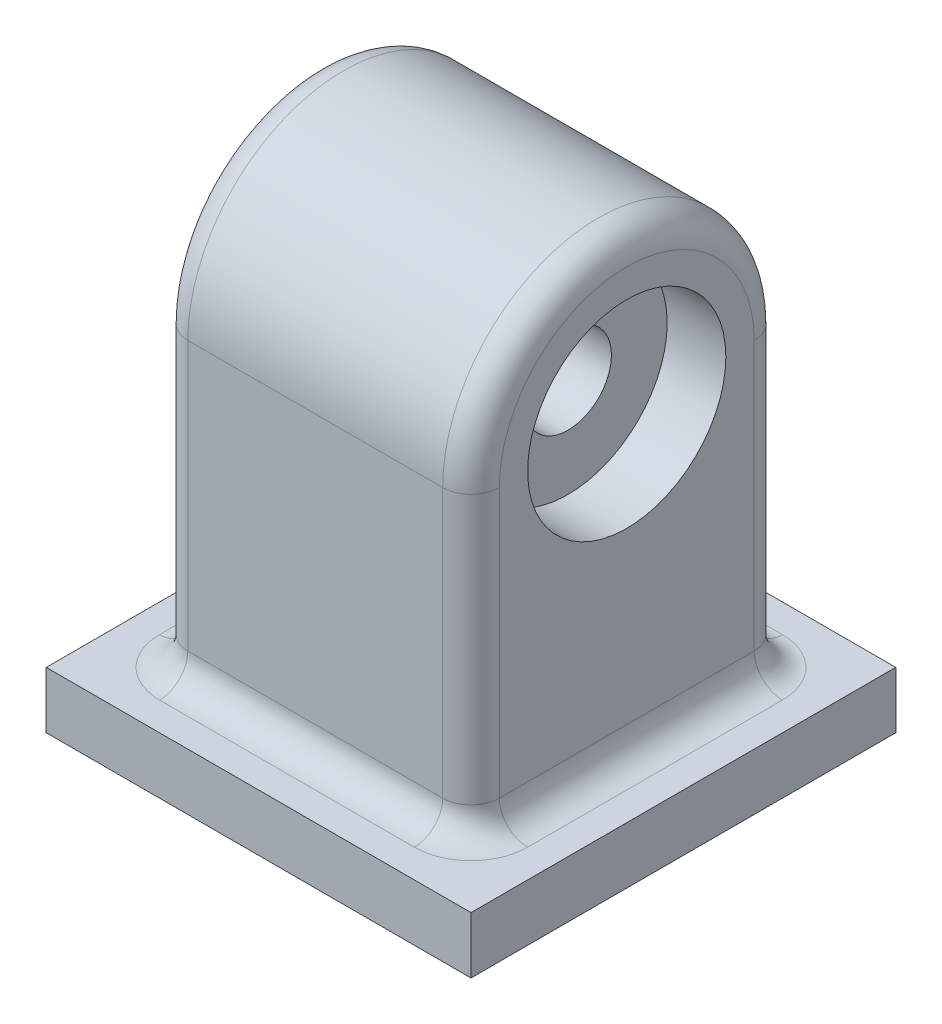
ISO-10303-21;
HEADER;
FILE_DESCRIPTION(('STEP AP214'),'2;1');
FILE_NAME('part.step','',(''),(''),'','','');
FILE_SCHEMA(('AUTOMOTIVE_DESIGN { 1 0 10303 214 1 1 1 1 }'));
ENDSEC;
DATA;
#1=APPLICATION_CONTEXT('core data for automotive mechanical design processes');
#2=APPLICATION_PROTOCOL_DEFINITION('international standard','automotive_design',2000,#1);
#3=PRODUCT_CONTEXT('',#1,'mechanical');
#4=PRODUCT('Part','Part','',(#3));
#5=PRODUCT_RELATED_PRODUCT_CATEGORY('part','',(#4));
#6=PRODUCT_DEFINITION_FORMATION('','',#4);
#7=PRODUCT_DEFINITION_CONTEXT('part definition',#1,'design');
#8=PRODUCT_DEFINITION('design','',#6,#7);
#9=PRODUCT_DEFINITION_SHAPE('','',#8);
#10=(LENGTH_UNIT() NAMED_UNIT(*) SI_UNIT(.MILLI.,.METRE.));
#11=(NAMED_UNIT(*) PLANE_ANGLE_UNIT() SI_UNIT($,.RADIAN.));
#12=(NAMED_UNIT(*) SI_UNIT($,.STERADIAN.) SOLID_ANGLE_UNIT());
#13=UNCERTAINTY_MEASURE_WITH_UNIT(LENGTH_MEASURE(1.E-05),#10,'distance_accuracy_value','');
#14=(GEOMETRIC_REPRESENTATION_CONTEXT(3) GLOBAL_UNCERTAINTY_ASSIGNED_CONTEXT((#13)) GLOBAL_UNIT_ASSIGNED_CONTEXT((#10,
#11,#12)) REPRESENTATION_CONTEXT('',''));
#15=CARTESIAN_POINT('',(0.,0.,0.));
#16=DIRECTION('',(0.,0.,1.));
#17=DIRECTION('',(1.,0.,0.));
#18=AXIS2_PLACEMENT_3D('',#15,#16,#17);
#19=CARTESIAN_POINT('',(0.,25.4,0.));
#20=DIRECTION('',(0.,1.,0.));
#21=DIRECTION('',(0.,0.,1.));
#22=AXIS2_PLACEMENT_3D('',#19,#20,#21);
#23=PLANE('',#22);
#24=DIRECTION('',(0.,0.,-1.));
#25=VECTOR('',#24,1.);
#26=CARTESIAN_POINT('',(-95.2500000000001,25.4,0.));
#27=LINE('',#26,#25);
#28=CARTESIAN_POINT('',(-95.2500000000001,25.4,95.2500000000001));
#29=VERTEX_POINT('',#28);
#30=CARTESIAN_POINT('',(-95.2500000000001,25.4,-95.2500000000001));
#31=VERTEX_POINT('',#30);
#32=EDGE_CURVE('E164',#29,#31,#27,.T.);
#33=ORIENTED_EDGE('',*,*,#32,.F.);
#34=DIRECTION('',(-1.,0.,0.));
#35=VECTOR('',#34,1.);
#36=CARTESIAN_POINT('',(0.,25.4,95.2500000000001));
#37=LINE('',#36,#35);
#38=CARTESIAN_POINT('',(95.2500000000004,25.4,95.2500000000001));
#39=VERTEX_POINT('',#38);
#40=EDGE_CURVE('E178',#39,#29,#37,.T.);
#41=ORIENTED_EDGE('',*,*,#40,.F.);
#42=DIRECTION('',(0.,0.,-1.));
#43=VECTOR('',#42,1.);
#44=CARTESIAN_POINT('',(95.2500000000004,25.4,0.));
#45=LINE('',#44,#43);
#46=CARTESIAN_POINT('',(95.2500000000004,25.4,-95.2500000000001));
#47=VERTEX_POINT('',#46);
#48=EDGE_CURVE('E188',#39,#47,#45,.T.);
#49=ORIENTED_EDGE('',*,*,#48,.T.);
#50=DIRECTION('',(-1.,0.,0.));
#51=VECTOR('',#50,1.);
#52=CARTESIAN_POINT('',(0.,25.4,-95.2500000000001));
#53=LINE('',#52,#51);
#54=EDGE_CURVE('E180',#47,#31,#53,.T.);
#55=ORIENTED_EDGE('',*,*,#54,.T.);
#56=EDGE_LOOP('',(#33,#41,#49,#55));
#57=FACE_BOUND('',#56,.T.);
#58=CARTESIAN_POINT('',(-57.15,25.4,-57.15));
#59=DIRECTION('',(0.,1.,0.));
#60=DIRECTION('',(0.,0.,1.));
#61=AXIS2_PLACEMENT_3D('',#58,#59,#60);
#62=CIRCLE('',#61,25.4);
#63=CARTESIAN_POINT('',(-57.15,25.4,-82.5499999999999));
#64=VERTEX_POINT('',#63);
#65=CARTESIAN_POINT('',(-82.55,25.4,-57.15));
#66=VERTEX_POINT('',#65);
#67=EDGE_CURVE('E265',#64,#66,#62,.T.);
#68=ORIENTED_EDGE('',*,*,#67,.F.);
#69=DIRECTION('',(-1.,0.,0.));
#70=VECTOR('',#69,1.);
#71=CARTESIAN_POINT('',(0.,25.4,-82.5499999999999));
#72=LINE('',#71,#70);
#73=CARTESIAN_POINT('',(57.15,25.4,-82.5499999999999));
#74=VERTEX_POINT('',#73);
#75=EDGE_CURVE('E261',#64,#74,#72,.F.);
#76=ORIENTED_EDGE('',*,*,#75,.T.);
#77=CARTESIAN_POINT('',(57.15,25.4,-57.15));
#78=DIRECTION('',(0.,1.,0.));
#79=DIRECTION('',(0.,0.,1.));
#80=AXIS2_PLACEMENT_3D('',#77,#78,#79);
#81=CIRCLE('',#80,25.4);
#82=CARTESIAN_POINT('',(82.5500000000004,25.4,-57.15));
#83=VERTEX_POINT('',#82);
#84=EDGE_CURVE('E257',#83,#74,#81,.T.);
#85=ORIENTED_EDGE('',*,*,#84,.F.);
#86=DIRECTION('',(0.,0.,-1.));
#87=VECTOR('',#86,1.);
#88=CARTESIAN_POINT('',(82.5500000000004,25.4,0.));
#89=LINE('',#88,#87);
#90=CARTESIAN_POINT('',(82.5500000000005,25.4,57.15));
#91=VERTEX_POINT('',#90);
#92=EDGE_CURVE('E251',#83,#91,#89,.F.);
#93=ORIENTED_EDGE('',*,*,#92,.T.);
#94=CARTESIAN_POINT('',(57.15,25.4,57.15));
#95=DIRECTION('',(0.,1.,0.));
#96=DIRECTION('',(0.,0.,1.));
#97=AXIS2_PLACEMENT_3D('',#94,#95,#96);
#98=CIRCLE('',#97,25.4);
#99=CARTESIAN_POINT('',(57.15,25.4,82.5499999999999));
#100=VERTEX_POINT('',#99);
#101=EDGE_CURVE('E247',#100,#91,#98,.T.);
#102=ORIENTED_EDGE('',*,*,#101,.F.);
#103=DIRECTION('',(1.,0.,0.));
#104=VECTOR('',#103,1.);
#105=CARTESIAN_POINT('',(0.,25.4,82.5499999999999));
#106=LINE('',#105,#104);
#107=CARTESIAN_POINT('',(-57.15,25.4,82.5499999999999));
#108=VERTEX_POINT('',#107);
#109=EDGE_CURVE('E244',#100,#108,#106,.F.);
#110=ORIENTED_EDGE('',*,*,#109,.T.);
#111=CARTESIAN_POINT('',(-57.15,25.4,57.15));
#112=DIRECTION('',(0.,1.,0.));
#113=DIRECTION('',(0.,0.,1.));
#114=AXIS2_PLACEMENT_3D('',#111,#112,#113);
#115=CIRCLE('',#114,25.4);
#116=CARTESIAN_POINT('',(-82.55,25.4,57.15));
#117=VERTEX_POINT('',#116);
#118=EDGE_CURVE('E240',#117,#108,#115,.T.);
#119=ORIENTED_EDGE('',*,*,#118,.F.);
#120=DIRECTION('',(0.,0.,1.));
#121=VECTOR('',#120,1.);
#122=CARTESIAN_POINT('',(-82.55,25.4,0.));
#123=LINE('',#122,#121);
#124=EDGE_CURVE('E254',#117,#66,#123,.F.);
#125=ORIENTED_EDGE('',*,*,#124,.T.);
#126=EDGE_LOOP('',(#68,#76,#85,#93,#102,#110,#119,#125));
#127=FACE_BOUND('',#126,.T.);
#128=ADVANCED_FACE('F48',(#57,#127),#23,.T.);
#129=CARTESIAN_POINT('',(69.8500000000004,158.75,0.));
#130=DIRECTION('',(1.,0.,0.));
#131=DIRECTION('',(0.,0.,-1.));
#132=AXIS2_PLACEMENT_3D('',#129,#130,#131);
#133=CYLINDRICAL_SURFACE('',#132,69.85);
#134=DIRECTION('',(-1.,0.,0.));
#135=VECTOR('',#134,1.);
#136=CARTESIAN_POINT('',(69.8500000000004,158.75,69.85));
#137=LINE('',#136,#135);
#138=CARTESIAN_POINT('',(57.15,158.75,69.85));
#139=VERTEX_POINT('',#138);
#140=CARTESIAN_POINT('',(-57.15,158.75,69.85));
#141=VERTEX_POINT('',#140);
#142=EDGE_CURVE('E172',#139,#141,#137,.T.);
#143=ORIENTED_EDGE('',*,*,#142,.F.);
#144=CARTESIAN_POINT('',(57.15,158.75,0.));
#145=DIRECTION('',(-1.,0.,0.));
#146=DIRECTION('',(0.,0.,1.));
#147=AXIS2_PLACEMENT_3D('',#144,#145,#146);
#148=CIRCLE('',#147,69.85);
#149=CARTESIAN_POINT('',(57.15,158.75,-69.85));
#150=VERTEX_POINT('',#149);
#151=EDGE_CURVE('E298',#139,#150,#148,.T.);
#152=ORIENTED_EDGE('',*,*,#151,.T.);
#153=DIRECTION('',(-1.,0.,0.));
#154=VECTOR('',#153,1.);
#155=CARTESIAN_POINT('',(69.8500000000003,158.75,-69.85));
#156=LINE('',#155,#154);
#157=CARTESIAN_POINT('',(-57.15,158.75,-69.85));
#158=VERTEX_POINT('',#157);
#159=EDGE_CURVE('E220',#158,#150,#156,.F.);
#160=ORIENTED_EDGE('',*,*,#159,.F.);
#161=CARTESIAN_POINT('',(-57.15,158.75,0.));
#162=DIRECTION('',(1.,0.,0.));
#163=DIRECTION('',(0.,0.,-1.));
#164=AXIS2_PLACEMENT_3D('',#161,#162,#163);
#165=CIRCLE('',#164,69.85);
#166=EDGE_CURVE('E295',#158,#141,#165,.T.);
#167=ORIENTED_EDGE('',*,*,#166,.T.);
#168=EDGE_LOOP('',(#143,#152,#160,#167));
#169=FACE_BOUND('',#168,.T.);
#170=ADVANCED_FACE('F434',(#169),#133,.T.);
#171=CARTESIAN_POINT('',(-95.2500000000001,25.4,0.));
#172=DIRECTION('',(-1.,0.,0.));
#173=DIRECTION('',(0.,0.,1.));
#174=AXIS2_PLACEMENT_3D('',#171,#172,#173);
#175=PLANE('',#174);
#176=DIRECTION('',(0.,0.,-1.));
#177=VECTOR('',#176,1.);
#178=CARTESIAN_POINT('',(-95.2500000000001,0.,0.));
#179=LINE('',#178,#177);
#180=CARTESIAN_POINT('',(-95.2500000000001,0.,95.2500000000001));
#181=VERTEX_POINT('',#180);
#182=CARTESIAN_POINT('',(-95.2500000000001,0.,-95.2500000000001));
#183=VERTEX_POINT('',#182);
#184=EDGE_CURVE('E166',#181,#183,#179,.T.);
#185=ORIENTED_EDGE('',*,*,#184,.F.);
#186=DIRECTION('',(0.,-1.,0.));
#187=VECTOR('',#186,1.);
#188=CARTESIAN_POINT('',(-95.2500000000001,25.4,95.2500000000001));
#189=LINE('',#188,#187);
#190=EDGE_CURVE('E161',#29,#181,#189,.T.);
#191=ORIENTED_EDGE('',*,*,#190,.F.);
#192=ORIENTED_EDGE('',*,*,#32,.T.);
#193=DIRECTION('',(0.,-1.,0.));
#194=VECTOR('',#193,1.);
#195=CARTESIAN_POINT('',(-95.2500000000001,25.4,-95.2500000000001));
#196=LINE('',#195,#194);
#197=EDGE_CURVE('E197',#31,#183,#196,.T.);
#198=ORIENTED_EDGE('',*,*,#197,.T.);
#199=EDGE_LOOP('',(#185,#191,#192,#198));
#200=FACE_BOUND('',#199,.T.);
#201=ADVANCED_FACE('F163',(#200),#175,.T.);
#202=CARTESIAN_POINT('',(0.,25.4,95.2500000000001));
#203=DIRECTION('',(0.,0.,1.));
#204=DIRECTION('',(1.,0.,0.));
#205=AXIS2_PLACEMENT_3D('',#202,#203,#204);
#206=PLANE('',#205);
#207=DIRECTION('',(-1.,0.,0.));
#208=VECTOR('',#207,1.);
#209=CARTESIAN_POINT('',(0.,0.,95.2500000000001));
#210=LINE('',#209,#208);
#211=CARTESIAN_POINT('',(95.2500000000004,0.,95.2500000000001));
#212=VERTEX_POINT('',#211);
#213=EDGE_CURVE('E200',#212,#181,#210,.T.);
#214=ORIENTED_EDGE('',*,*,#213,.F.);
#215=DIRECTION('',(0.,-1.,0.));
#216=VECTOR('',#215,1.);
#217=CARTESIAN_POINT('',(95.2500000000004,25.4,95.2500000000001));
#218=LINE('',#217,#216);
#219=EDGE_CURVE('E173',#39,#212,#218,.T.);
#220=ORIENTED_EDGE('',*,*,#219,.F.);
#221=ORIENTED_EDGE('',*,*,#40,.T.);
#222=ORIENTED_EDGE('',*,*,#190,.T.);
#223=EDGE_LOOP('',(#214,#220,#221,#222));
#224=FACE_BOUND('',#223,.T.);
#225=ADVANCED_FACE('F185',(#224),#206,.T.);
#226=CARTESIAN_POINT('',(95.2500000000004,25.4,0.));
#227=DIRECTION('',(-1.,0.,0.));
#228=DIRECTION('',(0.,0.,1.));
#229=AXIS2_PLACEMENT_3D('',#226,#227,#228);
#230=PLANE('',#229);
#231=DIRECTION('',(0.,0.,-1.));
#232=VECTOR('',#231,1.);
#233=CARTESIAN_POINT('',(95.2500000000004,0.,0.));
#234=LINE('',#233,#232);
#235=CARTESIAN_POINT('',(95.2500000000004,0.,-95.2500000000001));
#236=VERTEX_POINT('',#235);
#237=EDGE_CURVE('E204',#212,#236,#234,.T.);
#238=ORIENTED_EDGE('',*,*,#237,.T.);
#239=DIRECTION('',(0.,-1.,0.));
#240=VECTOR('',#239,1.);
#241=CARTESIAN_POINT('',(95.2500000000004,25.4,-95.2500000000001));
#242=LINE('',#241,#240);
#243=EDGE_CURVE('E212',#47,#236,#242,.T.);
#244=ORIENTED_EDGE('',*,*,#243,.F.);
#245=ORIENTED_EDGE('',*,*,#48,.F.);
#246=ORIENTED_EDGE('',*,*,#219,.T.);
#247=EDGE_LOOP('',(#238,#244,#245,#246));
#248=FACE_BOUND('',#247,.T.);
#249=ADVANCED_FACE('F445',(#248),#230,.F.);
#250=CARTESIAN_POINT('',(0.,25.4,-95.2500000000001));
#251=DIRECTION('',(0.,0.,1.));
#252=DIRECTION('',(1.,0.,0.));
#253=AXIS2_PLACEMENT_3D('',#250,#251,#252);
#254=PLANE('',#253);
#255=DIRECTION('',(-1.,0.,0.));
#256=VECTOR('',#255,1.);
#257=CARTESIAN_POINT('',(0.,0.,-95.2500000000001));
#258=LINE('',#257,#256);
#259=EDGE_CURVE('E183',#236,#183,#258,.T.);
#260=ORIENTED_EDGE('',*,*,#259,.T.);
#261=ORIENTED_EDGE('',*,*,#197,.F.);
#262=ORIENTED_EDGE('',*,*,#54,.F.);
#263=ORIENTED_EDGE('',*,*,#243,.T.);
#264=EDGE_LOOP('',(#260,#261,#262,#263));
#265=FACE_BOUND('',#264,.T.);
#266=ADVANCED_FACE('F429',(#265),#254,.F.);
#267=CARTESIAN_POINT('',(0.,0.,0.));
#268=DIRECTION('',(0.,1.,0.));
#269=DIRECTION('',(0.,0.,1.));
#270=AXIS2_PLACEMENT_3D('',#267,#268,#269);
#271=PLANE('',#270);
#272=CARTESIAN_POINT('',(57.15,0.,57.15));
#273=DIRECTION('',(0.,1.,0.));
#274=DIRECTION('',(0.,0.,1.));
#275=AXIS2_PLACEMENT_3D('',#272,#273,#274);
#276=CIRCLE('',#275,9.525);
#277=CARTESIAN_POINT('',(57.15,0.,66.675));
#278=VERTEX_POINT('',#277);
#279=EDGE_CURVE('E382',#278,#278,#276,.T.);
#280=ORIENTED_EDGE('',*,*,#279,.T.);
#281=EDGE_LOOP('',(#280));
#282=FACE_BOUND('',#281,.T.);
#283=CARTESIAN_POINT('',(57.15,0.,-57.15));
#284=DIRECTION('',(0.,1.,0.));
#285=DIRECTION('',(0.,0.,1.));
#286=AXIS2_PLACEMENT_3D('',#283,#284,#285);
#287=CIRCLE('',#286,9.525);
#288=CARTESIAN_POINT('',(57.15,0.,-47.625));
#289=VERTEX_POINT('',#288);
#290=EDGE_CURVE('E390',#289,#289,#287,.T.);
#291=ORIENTED_EDGE('',*,*,#290,.T.);
#292=EDGE_LOOP('',(#291));
#293=FACE_BOUND('',#292,.T.);
#294=CARTESIAN_POINT('',(-57.15,0.,-57.15));
#295=DIRECTION('',(0.,1.,0.));
#296=DIRECTION('',(0.,0.,1.));
#297=AXIS2_PLACEMENT_3D('',#294,#295,#296);
#298=CIRCLE('',#297,9.52499999999999);
#299=CARTESIAN_POINT('',(-57.15,0.,-47.625));
#300=VERTEX_POINT('',#299);
#301=EDGE_CURVE('E398',#300,#300,#298,.T.);
#302=ORIENTED_EDGE('',*,*,#301,.T.);
#303=EDGE_LOOP('',(#302));
#304=FACE_BOUND('',#303,.T.);
#305=CARTESIAN_POINT('',(-57.15,0.,57.15));
#306=DIRECTION('',(0.,1.,0.));
#307=DIRECTION('',(0.,0.,1.));
#308=AXIS2_PLACEMENT_3D('',#305,#306,#307);
#309=CIRCLE('',#308,9.52499999999999);
#310=CARTESIAN_POINT('',(-57.15,0.,66.675));
#311=VERTEX_POINT('',#310);
#312=EDGE_CURVE('E402',#311,#311,#309,.T.);
#313=ORIENTED_EDGE('',*,*,#312,.T.);
#314=EDGE_LOOP('',(#313));
#315=FACE_BOUND('',#314,.T.);
#316=ORIENTED_EDGE('',*,*,#184,.T.);
#317=ORIENTED_EDGE('',*,*,#259,.F.);
#318=ORIENTED_EDGE('',*,*,#237,.F.);
#319=ORIENTED_EDGE('',*,*,#213,.T.);
#320=EDGE_LOOP('',(#316,#317,#318,#319));
#321=FACE_BOUND('',#320,.T.);
#322=ADVANCED_FACE('F413',(#282,#293,#304,#315,#321),#271,.F.);
#323=CARTESIAN_POINT('',(-57.15,-25.4,57.15));
#324=DIRECTION('',(0.,1.,0.));
#325=DIRECTION('',(0.,0.,1.));
#326=AXIS2_PLACEMENT_3D('',#323,#324,#325);
#327=CYLINDRICAL_SURFACE('',#326,9.52499999999999);
#328=CARTESIAN_POINT('',(-57.15,-25.4,57.15));
#329=DIRECTION('',(0.,1.,0.));
#330=DIRECTION('',(0.,0.,1.));
#331=AXIS2_PLACEMENT_3D('',#328,#329,#330);
#332=CIRCLE('',#331,9.52499999999999);
#333=CARTESIAN_POINT('',(-57.15,-25.4,66.675));
#334=VERTEX_POINT('',#333);
#335=EDGE_CURVE('E201',#334,#334,#332,.T.);
#336=ORIENTED_EDGE('',*,*,#335,.T.);
#337=EDGE_LOOP('',(#336));
#338=FACE_BOUND('',#337,.T.);
#339=ORIENTED_EDGE('',*,*,#312,.F.);
#340=EDGE_LOOP('',(#339));
#341=FACE_BOUND('',#340,.T.);
#342=ADVANCED_FACE('F416',(#338,#341),#327,.T.);
#343=CARTESIAN_POINT('',(-57.15,-25.4,57.15));
#344=DIRECTION('',(0.,1.,0.));
#345=DIRECTION('',(0.,0.,1.));
#346=AXIS2_PLACEMENT_3D('',#343,#344,#345);
#347=PLANE('',#346);
#348=ORIENTED_EDGE('',*,*,#335,.F.);
#349=EDGE_LOOP('',(#348));
#350=FACE_BOUND('',#349,.T.);
#351=ADVANCED_FACE('F418',(#350),#347,.F.);
#352=CARTESIAN_POINT('',(-57.15,-25.4,-57.15));
#353=DIRECTION('',(0.,1.,0.));
#354=DIRECTION('',(0.,0.,1.));
#355=AXIS2_PLACEMENT_3D('',#352,#353,#354);
#356=CYLINDRICAL_SURFACE('',#355,9.52499999999999);
#357=CARTESIAN_POINT('',(-57.15,-25.4,-57.15));
#358=DIRECTION('',(0.,1.,0.));
#359=DIRECTION('',(0.,0.,1.));
#360=AXIS2_PLACEMENT_3D('',#357,#358,#359);
#361=CIRCLE('',#360,9.52499999999999);
#362=CARTESIAN_POINT('',(-57.15,-25.4,-47.625));
#363=VERTEX_POINT('',#362);
#364=EDGE_CURVE('E394',#363,#363,#361,.T.);
#365=ORIENTED_EDGE('',*,*,#364,.T.);
#366=EDGE_LOOP('',(#365));
#367=FACE_BOUND('',#366,.T.);
#368=ORIENTED_EDGE('',*,*,#301,.F.);
#369=EDGE_LOOP('',(#368));
#370=FACE_BOUND('',#369,.T.);
#371=ADVANCED_FACE('F426',(#367,#370),#356,.T.);
#372=CARTESIAN_POINT('',(-57.15,-25.4,-57.15));
#373=DIRECTION('',(0.,1.,0.));
#374=DIRECTION('',(0.,0.,1.));
#375=AXIS2_PLACEMENT_3D('',#372,#373,#374);
#376=PLANE('',#375);
#377=ORIENTED_EDGE('',*,*,#364,.F.);
#378=EDGE_LOOP('',(#377));
#379=FACE_BOUND('',#378,.T.);
#380=ADVANCED_FACE('F574',(#379),#376,.F.);
#381=CARTESIAN_POINT('',(57.15,-25.4,-57.15));
#382=DIRECTION('',(0.,1.,0.));
#383=DIRECTION('',(0.,0.,1.));
#384=AXIS2_PLACEMENT_3D('',#381,#382,#383);
#385=CYLINDRICAL_SURFACE('',#384,9.525);
#386=CARTESIAN_POINT('',(57.15,-25.4,-57.15));
#387=DIRECTION('',(0.,1.,0.));
#388=DIRECTION('',(0.,0.,1.));
#389=AXIS2_PLACEMENT_3D('',#386,#387,#388);
#390=CIRCLE('',#389,9.525);
#391=CARTESIAN_POINT('',(57.15,-25.4,-47.625));
#392=VERTEX_POINT('',#391);
#393=EDGE_CURVE('E386',#392,#392,#390,.T.);
#394=ORIENTED_EDGE('',*,*,#393,.T.);
#395=EDGE_LOOP('',(#394));
#396=FACE_BOUND('',#395,.T.);
#397=ORIENTED_EDGE('',*,*,#290,.F.);
#398=EDGE_LOOP('',(#397));
#399=FACE_BOUND('',#398,.T.);
#400=ADVANCED_FACE('F571',(#396,#399),#385,.T.);
#401=CARTESIAN_POINT('',(57.15,-25.4,-57.15));
#402=DIRECTION('',(0.,1.,0.));
#403=DIRECTION('',(0.,0.,1.));
#404=AXIS2_PLACEMENT_3D('',#401,#402,#403);
#405=PLANE('',#404);
#406=ORIENTED_EDGE('',*,*,#393,.F.);
#407=EDGE_LOOP('',(#406));
#408=FACE_BOUND('',#407,.T.);
#409=ADVANCED_FACE('F568',(#408),#405,.F.);
#410=CARTESIAN_POINT('',(57.15,-25.4,57.15));
#411=DIRECTION('',(0.,1.,0.));
#412=DIRECTION('',(0.,0.,1.));
#413=AXIS2_PLACEMENT_3D('',#410,#411,#412);
#414=CYLINDRICAL_SURFACE('',#413,9.525);
#415=CARTESIAN_POINT('',(57.15,-25.4,57.15));
#416=DIRECTION('',(0.,1.,0.));
#417=DIRECTION('',(0.,0.,1.));
#418=AXIS2_PLACEMENT_3D('',#415,#416,#417);
#419=CIRCLE('',#418,9.525);
#420=CARTESIAN_POINT('',(57.15,-25.4,66.675));
#421=VERTEX_POINT('',#420);
#422=EDGE_CURVE('E229',#421,#421,#419,.T.);
#423=ORIENTED_EDGE('',*,*,#422,.T.);
#424=EDGE_LOOP('',(#423));
#425=FACE_BOUND('',#424,.T.);
#426=ORIENTED_EDGE('',*,*,#279,.F.);
#427=EDGE_LOOP('',(#426));
#428=FACE_BOUND('',#427,.T.);
#429=ADVANCED_FACE('F562',(#425,#428),#414,.T.);
#430=CARTESIAN_POINT('',(57.15,-25.4,57.15));
#431=DIRECTION('',(0.,1.,0.));
#432=DIRECTION('',(0.,0.,1.));
#433=AXIS2_PLACEMENT_3D('',#430,#431,#432);
#434=PLANE('',#433);
#435=ORIENTED_EDGE('',*,*,#422,.F.);
#436=EDGE_LOOP('',(#435));
#437=FACE_BOUND('',#436,.T.);
#438=ADVANCED_FACE('F554',(#437),#434,.F.);
#439=CARTESIAN_POINT('',(69.8500000000004,228.6,-69.85));
#440=DIRECTION('',(0.,0.,1.));
#441=DIRECTION('',(1.,0.,0.));
#442=AXIS2_PLACEMENT_3D('',#439,#440,#441);
#443=PLANE('',#442);
#444=ORIENTED_EDGE('',*,*,#159,.T.);
#445=DIRECTION('',(0.,-1.,0.));
#446=VECTOR('',#445,1.);
#447=CARTESIAN_POINT('',(57.15,228.6,-69.85));
#448=LINE('',#447,#446);
#449=CARTESIAN_POINT('',(57.15,38.1,-69.85));
#450=VERTEX_POINT('',#449);
#451=EDGE_CURVE('E237',#150,#450,#448,.T.);
#452=ORIENTED_EDGE('',*,*,#451,.T.);
#453=DIRECTION('',(-1.,0.,0.));
#454=VECTOR('',#453,1.);
#455=CARTESIAN_POINT('',(69.8500000000004,38.1,-69.85));
#456=LINE('',#455,#454);
#457=CARTESIAN_POINT('',(-57.15,38.1,-69.85));
#458=VERTEX_POINT('',#457);
#459=EDGE_CURVE('E233',#450,#458,#456,.T.);
#460=ORIENTED_EDGE('',*,*,#459,.T.);
#461=DIRECTION('',(0.,-1.,0.));
#462=VECTOR('',#461,1.);
#463=CARTESIAN_POINT('',(-57.15,228.6,-69.85));
#464=LINE('',#463,#462);
#465=EDGE_CURVE('E224',#458,#158,#464,.F.);
#466=ORIENTED_EDGE('',*,*,#465,.T.);
#467=EDGE_LOOP('',(#444,#452,#460,#466));
#468=FACE_BOUND('',#467,.T.);
#469=ADVANCED_FACE('F552',(#468),#443,.F.);
#470=CARTESIAN_POINT('',(-69.8500000000001,228.6,-69.85));
#471=DIRECTION('',(1.,0.,0.));
#472=DIRECTION('',(0.,0.,-1.));
#473=AXIS2_PLACEMENT_3D('',#470,#471,#472);
#474=PLANE('',#473);
#475=DIRECTION('',(0.,-1.,0.));
#476=VECTOR('',#475,1.);
#477=CARTESIAN_POINT('',(-69.8500000000001,228.6,-57.15));
#478=LINE('',#477,#476);
#479=CARTESIAN_POINT('',(-69.8500000000001,158.75,-57.15));
#480=VERTEX_POINT('',#479);
#481=CARTESIAN_POINT('',(-69.8500000000001,38.1,-57.15));
#482=VERTEX_POINT('',#481);
#483=EDGE_CURVE('E275',#480,#482,#478,.T.);
#484=ORIENTED_EDGE('',*,*,#483,.T.);
#485=DIRECTION('',(0.,0.,1.));
#486=VECTOR('',#485,1.);
#487=CARTESIAN_POINT('',(-69.8500000000001,38.1,-69.85));
#488=LINE('',#487,#486);
#489=CARTESIAN_POINT('',(-69.85,38.1,57.15));
#490=VERTEX_POINT('',#489);
#491=EDGE_CURVE('E278',#482,#490,#488,.T.);
#492=ORIENTED_EDGE('',*,*,#491,.T.);
#493=DIRECTION('',(0.,-1.,0.));
#494=VECTOR('',#493,1.);
#495=CARTESIAN_POINT('',(-69.85,228.6,57.15));
#496=LINE('',#495,#494);
#497=CARTESIAN_POINT('',(-69.85,158.75,57.15));
#498=VERTEX_POINT('',#497);
#499=EDGE_CURVE('E269',#490,#498,#496,.F.);
#500=ORIENTED_EDGE('',*,*,#499,.T.);
#501=CARTESIAN_POINT('',(-69.85,158.75,0.));
#502=DIRECTION('',(1.,0.,0.));
#503=DIRECTION('',(0.,0.,-1.));
#504=AXIS2_PLACEMENT_3D('',#501,#502,#503);
#505=CIRCLE('',#504,57.15);
#506=EDGE_CURVE('E272',#498,#480,#505,.F.);
#507=ORIENTED_EDGE('',*,*,#506,.T.);
#508=EDGE_LOOP('',(#484,#492,#500,#507));
#509=FACE_BOUND('',#508,.T.);
#510=CARTESIAN_POINT('',(-69.85,158.75,0.));
#511=DIRECTION('',(1.,0.,0.));
#512=DIRECTION('',(0.,0.,-1.));
#513=AXIS2_PLACEMENT_3D('',#510,#511,#512);
#514=CIRCLE('',#513,19.44624);
#515=CARTESIAN_POINT('',(-69.85,158.75,-19.44624));
#516=VERTEX_POINT('',#515);
#517=EDGE_CURVE('E225',#516,#516,#514,.T.);
#518=ORIENTED_EDGE('',*,*,#517,.T.);
#519=EDGE_LOOP('',(#518));
#520=FACE_BOUND('',#519,.T.);
#521=ADVANCED_FACE('F540',(#509,#520),#474,.F.);
#522=CARTESIAN_POINT('',(-69.85,228.6,69.85));
#523=DIRECTION('',(0.,0.,-1.));
#524=DIRECTION('',(-1.,0.,0.));
#525=AXIS2_PLACEMENT_3D('',#522,#523,#524);
#526=PLANE('',#525);
#527=DIRECTION('',(1.,0.,0.));
#528=VECTOR('',#527,1.);
#529=CARTESIAN_POINT('',(-69.85,38.1,69.85));
#530=LINE('',#529,#528);
#531=CARTESIAN_POINT('',(-57.15,38.1,69.85));
#532=VERTEX_POINT('',#531);
#533=CARTESIAN_POINT('',(57.15,38.1,69.85));
#534=VERTEX_POINT('',#533);
#535=EDGE_CURVE('E58',#532,#534,#530,.T.);
#536=ORIENTED_EDGE('',*,*,#535,.T.);
#537=DIRECTION('',(0.,-1.,0.));
#538=VECTOR('',#537,1.);
#539=CARTESIAN_POINT('',(57.15,228.6,69.85));
#540=LINE('',#539,#538);
#541=EDGE_CURVE('E11',#534,#139,#540,.F.);
#542=ORIENTED_EDGE('',*,*,#541,.T.);
#543=ORIENTED_EDGE('',*,*,#142,.T.);
#544=DIRECTION('',(0.,-1.,0.));
#545=VECTOR('',#544,1.);
#546=CARTESIAN_POINT('',(-57.15,228.6,69.85));
#547=LINE('',#546,#545);
#548=EDGE_CURVE('E69',#141,#532,#547,.T.);
#549=ORIENTED_EDGE('',*,*,#548,.T.);
#550=EDGE_LOOP('',(#536,#542,#543,#549));
#551=FACE_BOUND('',#550,.T.);
#552=ADVANCED_FACE('F530',(#551),#526,.F.);
#553=CARTESIAN_POINT('',(69.8500000000004,228.6,69.85));
#554=DIRECTION('',(-1.,0.,0.));
#555=DIRECTION('',(0.,0.,1.));
#556=AXIS2_PLACEMENT_3D('',#553,#554,#555);
#557=PLANE('',#556);
#558=DIRECTION('',(0.,-1.,0.));
#559=VECTOR('',#558,1.);
#560=CARTESIAN_POINT('',(69.8500000000004,228.6,57.15));
#561=LINE('',#560,#559);
#562=CARTESIAN_POINT('',(69.8500000000004,158.75,57.15));
#563=VERTEX_POINT('',#562);
#564=CARTESIAN_POINT('',(69.8500000000004,38.1,57.15));
#565=VERTEX_POINT('',#564);
#566=EDGE_CURVE('E282',#563,#565,#561,.T.);
#567=ORIENTED_EDGE('',*,*,#566,.T.);
#568=DIRECTION('',(0.,0.,-1.));
#569=VECTOR('',#568,1.);
#570=CARTESIAN_POINT('',(69.8500000000004,38.1,69.85));
#571=LINE('',#570,#569);
#572=CARTESIAN_POINT('',(69.8500000000004,38.1,-57.15));
#573=VERTEX_POINT('',#572);
#574=EDGE_CURVE('E291',#565,#573,#571,.T.);
#575=ORIENTED_EDGE('',*,*,#574,.T.);
#576=DIRECTION('',(0.,-1.,0.));
#577=VECTOR('',#576,1.);
#578=CARTESIAN_POINT('',(69.8500000000004,228.6,-57.15));
#579=LINE('',#578,#577);
#580=CARTESIAN_POINT('',(69.8500000000004,158.75,-57.15));
#581=VERTEX_POINT('',#580);
#582=EDGE_CURVE('E288',#573,#581,#579,.F.);
#583=ORIENTED_EDGE('',*,*,#582,.T.);
#584=CARTESIAN_POINT('',(69.8500000000004,158.75,0.));
#585=DIRECTION('',(-1.,0.,0.));
#586=DIRECTION('',(0.,0.,1.));
#587=AXIS2_PLACEMENT_3D('',#584,#585,#586);
#588=CIRCLE('',#587,57.15);
#589=EDGE_CURVE('E285',#581,#563,#588,.F.);
#590=ORIENTED_EDGE('',*,*,#589,.T.);
#591=EDGE_LOOP('',(#567,#575,#583,#590));
#592=FACE_BOUND('',#591,.T.);
#593=CARTESIAN_POINT('',(69.8500000000004,158.75,0.));
#594=DIRECTION('',(1.,0.,0.));
#595=DIRECTION('',(0.,0.,-1.));
#596=AXIS2_PLACEMENT_3D('',#593,#594,#595);
#597=CIRCLE('',#596,44.45);
#598=CARTESIAN_POINT('',(69.8500000000004,158.75,-44.4500000000001));
#599=VERTEX_POINT('',#598);
#600=EDGE_CURVE('E365',#599,#599,#597,.T.);
#601=ORIENTED_EDGE('',*,*,#600,.F.);
#602=EDGE_LOOP('',(#601));
#603=FACE_BOUND('',#602,.T.);
#604=ADVANCED_FACE('F523',(#592,#603),#557,.F.);
#605=CARTESIAN_POINT('',(69.8500000000004,158.75,0.));
#606=DIRECTION('',(1.,0.,0.));
#607=DIRECTION('',(0.,0.,-1.));
#608=AXIS2_PLACEMENT_3D('',#605,#606,#607);
#609=CYLINDRICAL_SURFACE('',#608,19.44624);
#610=CARTESIAN_POINT('',(43.5356,158.75,0.));
#611=DIRECTION('',(1.,0.,0.));
#612=DIRECTION('',(0.,0.,-1.));
#613=AXIS2_PLACEMENT_3D('',#610,#611,#612);
#614=CIRCLE('',#613,19.44624);
#615=CARTESIAN_POINT('',(43.5356,158.75,-19.44624));
#616=VERTEX_POINT('',#615);
#617=EDGE_CURVE('E230',#616,#616,#614,.T.);
#618=ORIENTED_EDGE('',*,*,#617,.T.);
#619=EDGE_LOOP('',(#618));
#620=FACE_BOUND('',#619,.T.);
#621=ORIENTED_EDGE('',*,*,#517,.F.);
#622=EDGE_LOOP('',(#621));
#623=FACE_BOUND('',#622,.T.);
#624=ADVANCED_FACE('F625',(#620,#623),#609,.F.);
#625=CARTESIAN_POINT('',(43.5356,178.19624,0.));
#626=DIRECTION('',(-1.,0.,0.));
#627=DIRECTION('',(0.,0.,1.));
#628=AXIS2_PLACEMENT_3D('',#625,#626,#627);
#629=PLANE('',#628);
#630=ORIENTED_EDGE('',*,*,#617,.F.);
#631=EDGE_LOOP('',(#630));
#632=FACE_BOUND('',#631,.T.);
#633=CARTESIAN_POINT('',(43.5356,158.75,0.));
#634=DIRECTION('',(1.,0.,0.));
#635=DIRECTION('',(0.,0.,-1.));
#636=AXIS2_PLACEMENT_3D('',#633,#634,#635);
#637=CIRCLE('',#636,44.45);
#638=CARTESIAN_POINT('',(43.5356,158.75,-44.4500000000001));
#639=VERTEX_POINT('',#638);
#640=EDGE_CURVE('E370',#639,#639,#637,.T.);
#641=ORIENTED_EDGE('',*,*,#640,.T.);
#642=EDGE_LOOP('',(#641));
#643=FACE_BOUND('',#642,.T.);
#644=ADVANCED_FACE('F633',(#632,#643),#629,.F.);
#645=CARTESIAN_POINT('',(69.8500000000004,158.75,0.));
#646=DIRECTION('',(1.,0.,0.));
#647=DIRECTION('',(0.,0.,-1.));
#648=AXIS2_PLACEMENT_3D('',#645,#646,#647);
#649=CYLINDRICAL_SURFACE('',#648,44.45);
#650=ORIENTED_EDGE('',*,*,#640,.F.);
#651=EDGE_LOOP('',(#650));
#652=FACE_BOUND('',#651,.T.);
#653=ORIENTED_EDGE('',*,*,#600,.T.);
#654=EDGE_LOOP('',(#653));
#655=FACE_BOUND('',#654,.T.);
#656=ADVANCED_FACE('F510',(#652,#655),#649,.F.);
#657=CARTESIAN_POINT('',(57.15,228.6,57.15));
#658=DIRECTION('',(0.,-1.,0.));
#659=DIRECTION('',(0.,0.,-1.));
#660=AXIS2_PLACEMENT_3D('',#657,#658,#659);
#661=CYLINDRICAL_SURFACE('',#660,12.7);
#662=CARTESIAN_POINT('',(57.15,158.75,57.15));
#663=DIRECTION('',(0.,1.,0.));
#664=DIRECTION('',(0.,0.,1.));
#665=AXIS2_PLACEMENT_3D('',#662,#663,#664);
#666=CIRCLE('',#665,12.7);
#667=EDGE_CURVE('E353',#139,#563,#666,.T.);
#668=ORIENTED_EDGE('',*,*,#667,.F.);
#669=ORIENTED_EDGE('',*,*,#541,.F.);
#670=CARTESIAN_POINT('',(57.15,38.1,57.15));
#671=DIRECTION('',(0.,1.,0.));
#672=DIRECTION('',(0.,0.,1.));
#673=AXIS2_PLACEMENT_3D('',#670,#671,#672);
#674=CIRCLE('',#673,12.7);
#675=EDGE_CURVE('E356',#565,#534,#674,.F.);
#676=ORIENTED_EDGE('',*,*,#675,.F.);
#677=ORIENTED_EDGE('',*,*,#566,.F.);
#678=EDGE_LOOP('',(#668,#669,#676,#677));
#679=FACE_BOUND('',#678,.T.);
#680=ADVANCED_FACE('F50',(#679),#661,.T.);
#681=CARTESIAN_POINT('',(-57.15,228.6,57.15));
#682=DIRECTION('',(0.,-1.,0.));
#683=DIRECTION('',(0.,0.,-1.));
#684=AXIS2_PLACEMENT_3D('',#681,#682,#683);
#685=CYLINDRICAL_SURFACE('',#684,12.7);
#686=CARTESIAN_POINT('',(-57.15,38.1,57.15));
#687=DIRECTION('',(0.,1.,0.));
#688=DIRECTION('',(0.,0.,1.));
#689=AXIS2_PLACEMENT_3D('',#686,#687,#688);
#690=CIRCLE('',#689,12.7);
#691=EDGE_CURVE('E345',#532,#490,#690,.F.);
#692=ORIENTED_EDGE('',*,*,#691,.F.);
#693=ORIENTED_EDGE('',*,*,#548,.F.);
#694=CARTESIAN_POINT('',(-57.15,158.75,57.15));
#695=DIRECTION('',(0.,1.,0.));
#696=DIRECTION('',(0.,0.,1.));
#697=AXIS2_PLACEMENT_3D('',#694,#695,#696);
#698=CIRCLE('',#697,12.7);
#699=EDGE_CURVE('E349',#498,#141,#698,.T.);
#700=ORIENTED_EDGE('',*,*,#699,.F.);
#701=ORIENTED_EDGE('',*,*,#499,.F.);
#702=EDGE_LOOP('',(#692,#693,#700,#701));
#703=FACE_BOUND('',#702,.T.);
#704=ADVANCED_FACE('F502',(#703),#685,.T.);
#705=CARTESIAN_POINT('',(-69.85,38.1,82.5499999999999));
#706=DIRECTION('',(1.,0.,0.));
#707=DIRECTION('',(0.,0.,-1.));
#708=AXIS2_PLACEMENT_3D('',#705,#706,#707);
#709=CYLINDRICAL_SURFACE('',#708,12.7);
#710=CARTESIAN_POINT('',(-57.15,38.1,82.5499999999999));
#711=DIRECTION('',(1.,0.,0.));
#712=DIRECTION('',(0.,0.,-1.));
#713=AXIS2_PLACEMENT_3D('',#710,#711,#712);
#714=CIRCLE('',#713,12.7);
#715=EDGE_CURVE('E341',#108,#532,#714,.T.);
#716=ORIENTED_EDGE('',*,*,#715,.F.);
#717=ORIENTED_EDGE('',*,*,#109,.F.);
#718=CARTESIAN_POINT('',(57.15,38.1,82.5499999999999));
#719=DIRECTION('',(-1.,0.,0.));
#720=DIRECTION('',(0.,0.,1.));
#721=AXIS2_PLACEMENT_3D('',#718,#719,#720);
#722=CIRCLE('',#721,12.7);
#723=EDGE_CURVE('E52',#534,#100,#722,.T.);
#724=ORIENTED_EDGE('',*,*,#723,.F.);
#725=ORIENTED_EDGE('',*,*,#535,.F.);
#726=EDGE_LOOP('',(#716,#717,#724,#725));
#727=FACE_BOUND('',#726,.T.);
#728=ADVANCED_FACE('F500',(#727),#709,.F.);
#729=CARTESIAN_POINT('',(57.15,38.1,57.15));
#730=DIRECTION('',(0.,1.,0.));
#731=DIRECTION('',(0.,0.,1.));
#732=AXIS2_PLACEMENT_3D('',#729,#730,#731);
#733=TOROIDAL_SURFACE('',#732,25.4,12.7);
#734=ORIENTED_EDGE('',*,*,#723,.T.);
#735=ORIENTED_EDGE('',*,*,#101,.T.);
#736=CARTESIAN_POINT('',(82.5500000000005,38.1,57.15));
#737=DIRECTION('',(0.,0.,-1.));
#738=DIRECTION('',(-1.,0.,0.));
#739=AXIS2_PLACEMENT_3D('',#736,#737,#738);
#740=CIRCLE('',#739,12.7);
#741=EDGE_CURVE('E337',#565,#91,#740,.F.);
#742=ORIENTED_EDGE('',*,*,#741,.F.);
#743=ORIENTED_EDGE('',*,*,#675,.T.);
#744=EDGE_LOOP('',(#734,#735,#742,#743));
#745=FACE_BOUND('',#744,.T.);
#746=ADVANCED_FACE('F496',(#745),#733,.F.);
#747=CARTESIAN_POINT('',(57.15,158.75,0.));
#748=DIRECTION('',(-1.,0.,0.));
#749=DIRECTION('',(0.,0.,1.));
#750=AXIS2_PLACEMENT_3D('',#747,#748,#749);
#751=TOROIDAL_SURFACE('',#750,57.15,12.7);
#752=ORIENTED_EDGE('',*,*,#667,.T.);
#753=ORIENTED_EDGE('',*,*,#589,.F.);
#754=CARTESIAN_POINT('',(57.15,158.75,-57.15));
#755=DIRECTION('',(0.,-1.,0.));
#756=DIRECTION('',(0.,0.,-1.));
#757=AXIS2_PLACEMENT_3D('',#754,#755,#756);
#758=CIRCLE('',#757,12.7);
#759=EDGE_CURVE('E333',#150,#581,#758,.T.);
#760=ORIENTED_EDGE('',*,*,#759,.F.);
#761=ORIENTED_EDGE('',*,*,#151,.F.);
#762=EDGE_LOOP('',(#752,#753,#760,#761));
#763=FACE_BOUND('',#762,.T.);
#764=ADVANCED_FACE('F492',(#763),#751,.T.);
#765=CARTESIAN_POINT('',(-57.15,158.75,0.));
#766=DIRECTION('',(1.,0.,0.));
#767=DIRECTION('',(0.,0.,-1.));
#768=AXIS2_PLACEMENT_3D('',#765,#766,#767);
#769=TOROIDAL_SURFACE('',#768,57.15,12.7);
#770=ORIENTED_EDGE('',*,*,#699,.T.);
#771=ORIENTED_EDGE('',*,*,#166,.F.);
#772=CARTESIAN_POINT('',(-57.15,158.75,-57.15));
#773=DIRECTION('',(0.,-1.,0.));
#774=DIRECTION('',(0.,0.,-1.));
#775=AXIS2_PLACEMENT_3D('',#772,#773,#774);
#776=CIRCLE('',#775,12.7);
#777=EDGE_CURVE('E329',#480,#158,#776,.T.);
#778=ORIENTED_EDGE('',*,*,#777,.F.);
#779=ORIENTED_EDGE('',*,*,#506,.F.);
#780=EDGE_LOOP('',(#770,#771,#778,#779));
#781=FACE_BOUND('',#780,.T.);
#782=ADVANCED_FACE('F488',(#781),#769,.T.);
#783=CARTESIAN_POINT('',(-57.15,38.1,57.15));
#784=DIRECTION('',(0.,1.,0.));
#785=DIRECTION('',(0.,0.,1.));
#786=AXIS2_PLACEMENT_3D('',#783,#784,#785);
#787=TOROIDAL_SURFACE('',#786,25.4,12.7);
#788=ORIENTED_EDGE('',*,*,#715,.T.);
#789=ORIENTED_EDGE('',*,*,#691,.T.);
#790=CARTESIAN_POINT('',(-82.55,38.1,57.15));
#791=DIRECTION('',(0.,0.,-1.));
#792=DIRECTION('',(-1.,0.,0.));
#793=AXIS2_PLACEMENT_3D('',#790,#791,#792);
#794=CIRCLE('',#793,12.7);
#795=EDGE_CURVE('E326',#117,#490,#794,.F.);
#796=ORIENTED_EDGE('',*,*,#795,.F.);
#797=ORIENTED_EDGE('',*,*,#118,.T.);
#798=EDGE_LOOP('',(#788,#789,#796,#797));
#799=FACE_BOUND('',#798,.T.);
#800=ADVANCED_FACE('F484',(#799),#787,.F.);
#801=CARTESIAN_POINT('',(82.5500000000005,38.1,69.85));
#802=DIRECTION('',(0.,0.,-1.));
#803=DIRECTION('',(-1.,0.,0.));
#804=AXIS2_PLACEMENT_3D('',#801,#802,#803);
#805=CYLINDRICAL_SURFACE('',#804,12.7);
#806=ORIENTED_EDGE('',*,*,#741,.T.);
#807=ORIENTED_EDGE('',*,*,#92,.F.);
#808=CARTESIAN_POINT('',(82.5500000000004,38.1,-57.15));
#809=DIRECTION('',(0.,0.,1.));
#810=DIRECTION('',(1.,0.,0.));
#811=AXIS2_PLACEMENT_3D('',#808,#809,#810);
#812=CIRCLE('',#811,12.7);
#813=EDGE_CURVE('E322',#573,#83,#812,.T.);
#814=ORIENTED_EDGE('',*,*,#813,.F.);
#815=ORIENTED_EDGE('',*,*,#574,.F.);
#816=EDGE_LOOP('',(#806,#807,#814,#815));
#817=FACE_BOUND('',#816,.T.);
#818=ADVANCED_FACE('F480',(#817),#805,.F.);
#819=CARTESIAN_POINT('',(57.15,228.6,-57.15));
#820=DIRECTION('',(0.,-1.,0.));
#821=DIRECTION('',(0.,0.,-1.));
#822=AXIS2_PLACEMENT_3D('',#819,#820,#821);
#823=CYLINDRICAL_SURFACE('',#822,12.7);
#824=ORIENTED_EDGE('',*,*,#759,.T.);
#825=ORIENTED_EDGE('',*,*,#582,.F.);
#826=CARTESIAN_POINT('',(57.15,38.1,-57.15));
#827=DIRECTION('',(0.,1.,0.));
#828=DIRECTION('',(0.,0.,1.));
#829=AXIS2_PLACEMENT_3D('',#826,#827,#828);
#830=CIRCLE('',#829,12.7);
#831=EDGE_CURVE('E319',#450,#573,#830,.F.);
#832=ORIENTED_EDGE('',*,*,#831,.F.);
#833=ORIENTED_EDGE('',*,*,#451,.F.);
#834=EDGE_LOOP('',(#824,#825,#832,#833));
#835=FACE_BOUND('',#834,.T.);
#836=ADVANCED_FACE('F476',(#835),#823,.T.);
#837=CARTESIAN_POINT('',(-57.15,228.6,-57.15));
#838=DIRECTION('',(0.,-1.,0.));
#839=DIRECTION('',(0.,0.,-1.));
#840=AXIS2_PLACEMENT_3D('',#837,#838,#839);
#841=CYLINDRICAL_SURFACE('',#840,12.7);
#842=ORIENTED_EDGE('',*,*,#777,.T.);
#843=ORIENTED_EDGE('',*,*,#465,.F.);
#844=CARTESIAN_POINT('',(-57.15,38.1,-57.15));
#845=DIRECTION('',(0.,1.,0.));
#846=DIRECTION('',(0.,0.,1.));
#847=AXIS2_PLACEMENT_3D('',#844,#845,#846);
#848=CIRCLE('',#847,12.7);
#849=EDGE_CURVE('E315',#482,#458,#848,.F.);
#850=ORIENTED_EDGE('',*,*,#849,.F.);
#851=ORIENTED_EDGE('',*,*,#483,.F.);
#852=EDGE_LOOP('',(#842,#843,#850,#851));
#853=FACE_BOUND('',#852,.T.);
#854=ADVANCED_FACE('F472',(#853),#841,.T.);
#855=CARTESIAN_POINT('',(-82.55,38.1,-69.85));
#856=DIRECTION('',(0.,0.,1.));
#857=DIRECTION('',(1.,0.,0.));
#858=AXIS2_PLACEMENT_3D('',#855,#856,#857);
#859=CYLINDRICAL_SURFACE('',#858,12.7);
#860=ORIENTED_EDGE('',*,*,#795,.T.);
#861=ORIENTED_EDGE('',*,*,#491,.F.);
#862=CARTESIAN_POINT('',(-82.55,38.1,-57.15));
#863=DIRECTION('',(0.,0.,1.));
#864=DIRECTION('',(1.,0.,0.));
#865=AXIS2_PLACEMENT_3D('',#862,#863,#864);
#866=CIRCLE('',#865,12.7);
#867=EDGE_CURVE('E311',#66,#482,#866,.T.);
#868=ORIENTED_EDGE('',*,*,#867,.F.);
#869=ORIENTED_EDGE('',*,*,#124,.F.);
#870=EDGE_LOOP('',(#860,#861,#868,#869));
#871=FACE_BOUND('',#870,.T.);
#872=ADVANCED_FACE('F468',(#871),#859,.F.);
#873=CARTESIAN_POINT('',(57.15,38.1,-57.15));
#874=DIRECTION('',(0.,1.,0.));
#875=DIRECTION('',(0.,0.,1.));
#876=AXIS2_PLACEMENT_3D('',#873,#874,#875);
#877=TOROIDAL_SURFACE('',#876,25.4,12.7);
#878=ORIENTED_EDGE('',*,*,#813,.T.);
#879=ORIENTED_EDGE('',*,*,#84,.T.);
#880=CARTESIAN_POINT('',(57.15,38.1,-82.5499999999999));
#881=DIRECTION('',(-1.,0.,0.));
#882=DIRECTION('',(0.,0.,1.));
#883=AXIS2_PLACEMENT_3D('',#880,#881,#882);
#884=CIRCLE('',#883,12.7);
#885=EDGE_CURVE('E308',#450,#74,#884,.F.);
#886=ORIENTED_EDGE('',*,*,#885,.F.);
#887=ORIENTED_EDGE('',*,*,#831,.T.);
#888=EDGE_LOOP('',(#878,#879,#886,#887));
#889=FACE_BOUND('',#888,.T.);
#890=ADVANCED_FACE('F464',(#889),#877,.F.);
#891=CARTESIAN_POINT('',(-57.15,38.1,-57.15));
#892=DIRECTION('',(0.,1.,0.));
#893=DIRECTION('',(0.,0.,1.));
#894=AXIS2_PLACEMENT_3D('',#891,#892,#893);
#895=TOROIDAL_SURFACE('',#894,25.4,12.7);
#896=ORIENTED_EDGE('',*,*,#867,.T.);
#897=ORIENTED_EDGE('',*,*,#849,.T.);
#898=CARTESIAN_POINT('',(-57.15,38.1,-82.5499999999999));
#899=DIRECTION('',(1.,0.,0.));
#900=DIRECTION('',(0.,0.,-1.));
#901=AXIS2_PLACEMENT_3D('',#898,#899,#900);
#902=CIRCLE('',#901,12.7);
#903=EDGE_CURVE('E305',#64,#458,#902,.F.);
#904=ORIENTED_EDGE('',*,*,#903,.F.);
#905=ORIENTED_EDGE('',*,*,#67,.T.);
#906=EDGE_LOOP('',(#896,#897,#904,#905));
#907=FACE_BOUND('',#906,.T.);
#908=ADVANCED_FACE('F460',(#907),#895,.F.);
#909=CARTESIAN_POINT('',(69.8500000000004,38.1,-82.5499999999999));
#910=DIRECTION('',(-1.,0.,0.));
#911=DIRECTION('',(0.,0.,1.));
#912=AXIS2_PLACEMENT_3D('',#909,#910,#911);
#913=CYLINDRICAL_SURFACE('',#912,12.7);
#914=ORIENTED_EDGE('',*,*,#885,.T.);
#915=ORIENTED_EDGE('',*,*,#75,.F.);
#916=ORIENTED_EDGE('',*,*,#903,.T.);
#917=ORIENTED_EDGE('',*,*,#459,.F.);
#918=EDGE_LOOP('',(#914,#915,#916,#917));
#919=FACE_BOUND('',#918,.T.);
#920=ADVANCED_FACE('F457',(#919),#913,.F.);
#921=CLOSED_SHELL('',(#128,#170,#201,#225,#249,#266,#322,#342,#351,#371,#380,#400,#409,#429,
#438,#469,#521,#552,#604,#624,#644,#656,#680,#704,#728,#746,#764,#782,#800,#818,#836,#854,#872,
#890,#908,#920));
#922=MANIFOLD_SOLID_BREP('B2',#921);
#923=ADVANCED_BREP_SHAPE_REPRESENTATION('',(#18,#922),#14);
#924=SHAPE_DEFINITION_REPRESENTATION(#9,#923);
ENDSEC;
END-ISO-10303-21;
